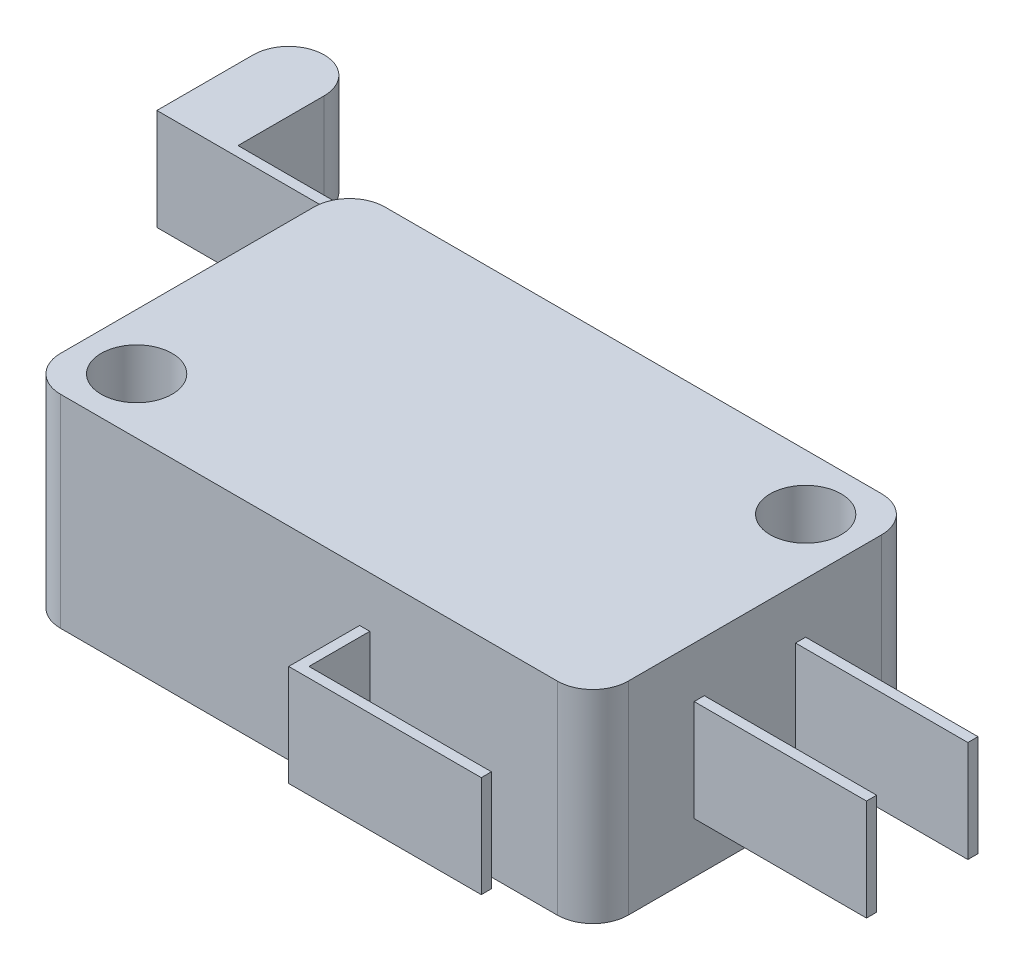
ISO-10303-21;
HEADER;
FILE_DESCRIPTION(('STEP AP214'),'2;1');
FILE_NAME('part.step','',(''),(''),'','','');
FILE_SCHEMA(('AUTOMOTIVE_DESIGN { 1 0 10303 214 1 1 1 1 }'));
ENDSEC;
DATA;
#1=APPLICATION_CONTEXT('core data for automotive mechanical design processes');
#2=APPLICATION_PROTOCOL_DEFINITION('international standard','automotive_design',2000,#1);
#3=PRODUCT_CONTEXT('',#1,'mechanical');
#4=PRODUCT('Part','Part','',(#3));
#5=PRODUCT_RELATED_PRODUCT_CATEGORY('part','',(#4));
#6=PRODUCT_DEFINITION_FORMATION('','',#4);
#7=PRODUCT_DEFINITION_CONTEXT('part definition',#1,'design');
#8=PRODUCT_DEFINITION('design','',#6,#7);
#9=PRODUCT_DEFINITION_SHAPE('','',#8);
#10=(LENGTH_UNIT() NAMED_UNIT(*) SI_UNIT(.MILLI.,.METRE.));
#11=(NAMED_UNIT(*) PLANE_ANGLE_UNIT() SI_UNIT($,.RADIAN.));
#12=(NAMED_UNIT(*) SI_UNIT($,.STERADIAN.) SOLID_ANGLE_UNIT());
#13=UNCERTAINTY_MEASURE_WITH_UNIT(LENGTH_MEASURE(1.E-05),#10,'distance_accuracy_value','');
#14=(GEOMETRIC_REPRESENTATION_CONTEXT(3) GLOBAL_UNCERTAINTY_ASSIGNED_CONTEXT((#13)) GLOBAL_UNIT_ASSIGNED_CONTEXT((#10,
#11,#12)) REPRESENTATION_CONTEXT('',''));
#15=CARTESIAN_POINT('',(0.,0.,0.));
#16=DIRECTION('',(0.,0.,1.));
#17=DIRECTION('',(1.,0.,0.));
#18=AXIS2_PLACEMENT_3D('',#15,#16,#17);
#19=CARTESIAN_POINT('',(28.,10.,0.));
#20=DIRECTION('',(-1.,0.,0.));
#21=DIRECTION('',(0.,0.,1.));
#22=AXIS2_PLACEMENT_3D('',#19,#20,#21);
#23=PLANE('',#22);
#24=DIRECTION('',(0.,0.,1.));
#25=VECTOR('',#24,1.);
#26=CARTESIAN_POINT('',(28.,2.5,0.));
#27=LINE('',#26,#25);
#28=CARTESIAN_POINT('',(28.,2.5,-5.5));
#29=VERTEX_POINT('',#28);
#30=CARTESIAN_POINT('',(28.,2.5,-5.));
#31=VERTEX_POINT('',#30);
#32=EDGE_CURVE('E284',#29,#31,#27,.T.);
#33=ORIENTED_EDGE('',*,*,#32,.T.);
#34=DIRECTION('',(0.,1.,0.));
#35=VECTOR('',#34,1.);
#36=CARTESIAN_POINT('',(28.,0.,-5.));
#37=LINE('',#36,#35);
#38=CARTESIAN_POINT('',(28.,7.5,-5.));
#39=VERTEX_POINT('',#38);
#40=EDGE_CURVE('E251',#31,#39,#37,.T.);
#41=ORIENTED_EDGE('',*,*,#40,.T.);
#42=DIRECTION('',(0.,0.,-1.));
#43=VECTOR('',#42,1.);
#44=CARTESIAN_POINT('',(28.,7.5,0.));
#45=LINE('',#44,#43);
#46=CARTESIAN_POINT('',(28.,7.5,-5.5));
#47=VERTEX_POINT('',#46);
#48=EDGE_CURVE('E269',#39,#47,#45,.T.);
#49=ORIENTED_EDGE('',*,*,#48,.T.);
#50=DIRECTION('',(0.,-1.,0.));
#51=VECTOR('',#50,1.);
#52=CARTESIAN_POINT('',(28.,0.,-5.5));
#53=LINE('',#52,#51);
#54=EDGE_CURVE('E288',#47,#29,#53,.T.);
#55=ORIENTED_EDGE('',*,*,#54,.T.);
#56=EDGE_LOOP('',(#33,#41,#49,#55));
#57=FACE_BOUND('',#56,.T.);
#58=DIRECTION('',(0.,0.,-1.));
#59=VECTOR('',#58,1.);
#60=CARTESIAN_POINT('',(28.,10.,0.));
#61=LINE('',#60,#59);
#62=CARTESIAN_POINT('',(28.,10.,-1.75));
#63=VERTEX_POINT('',#62);
#64=CARTESIAN_POINT('',(28.,10.,-14.25));
#65=VERTEX_POINT('',#64);
#66=EDGE_CURVE('E492',#63,#65,#61,.T.);
#67=ORIENTED_EDGE('',*,*,#66,.F.);
#68=DIRECTION('',(0.,-1.,0.));
#69=VECTOR('',#68,1.);
#70=CARTESIAN_POINT('',(28.,10.,-1.75));
#71=LINE('',#70,#69);
#72=CARTESIAN_POINT('',(28.,0.,-1.75));
#73=VERTEX_POINT('',#72);
#74=EDGE_CURVE('E536',#63,#73,#71,.T.);
#75=ORIENTED_EDGE('',*,*,#74,.T.);
#76=DIRECTION('',(0.,0.,-1.));
#77=VECTOR('',#76,1.);
#78=CARTESIAN_POINT('',(28.,0.,0.));
#79=LINE('',#78,#77);
#80=CARTESIAN_POINT('',(28.,0.,-14.25));
#81=VERTEX_POINT('',#80);
#82=EDGE_CURVE('E506',#73,#81,#79,.T.);
#83=ORIENTED_EDGE('',*,*,#82,.T.);
#84=DIRECTION('',(0.,-1.,0.));
#85=VECTOR('',#84,1.);
#86=CARTESIAN_POINT('',(28.,10.,-14.25));
#87=LINE('',#86,#85);
#88=EDGE_CURVE('E530',#81,#65,#87,.F.);
#89=ORIENTED_EDGE('',*,*,#88,.T.);
#90=EDGE_LOOP('',(#67,#75,#83,#89));
#91=FACE_BOUND('',#90,.T.);
#92=DIRECTION('',(0.,0.,-1.));
#93=VECTOR('',#92,1.);
#94=CARTESIAN_POINT('',(28.,2.5,0.));
#95=LINE('',#94,#93);
#96=CARTESIAN_POINT('',(28.,2.5,-9.99999999999999));
#97=VERTEX_POINT('',#96);
#98=CARTESIAN_POINT('',(28.,2.5,-10.5));
#99=VERTEX_POINT('',#98);
#100=EDGE_CURVE('E257',#97,#99,#95,.T.);
#101=ORIENTED_EDGE('',*,*,#100,.F.);
#102=DIRECTION('',(0.,-1.,0.));
#103=VECTOR('',#102,1.);
#104=CARTESIAN_POINT('',(28.,0.,-9.99999999999999));
#105=LINE('',#104,#103);
#106=CARTESIAN_POINT('',(28.,7.5,-10.));
#107=VERTEX_POINT('',#106);
#108=EDGE_CURVE('E308',#107,#97,#105,.T.);
#109=ORIENTED_EDGE('',*,*,#108,.F.);
#110=DIRECTION('',(0.,0.,1.));
#111=VECTOR('',#110,1.);
#112=CARTESIAN_POINT('',(28.,7.5,0.));
#113=LINE('',#112,#111);
#114=CARTESIAN_POINT('',(28.,7.5,-10.5));
#115=VERTEX_POINT('',#114);
#116=EDGE_CURVE('E325',#115,#107,#113,.T.);
#117=ORIENTED_EDGE('',*,*,#116,.F.);
#118=DIRECTION('',(0.,1.,0.));
#119=VECTOR('',#118,1.);
#120=CARTESIAN_POINT('',(28.,0.,-10.5));
#121=LINE('',#120,#119);
#122=EDGE_CURVE('E321',#99,#115,#121,.T.);
#123=ORIENTED_EDGE('',*,*,#122,.F.);
#124=EDGE_LOOP('',(#101,#109,#117,#123));
#125=FACE_BOUND('',#124,.T.);
#126=ADVANCED_FACE('F41',(#57,#91,#125),#23,.F.);
#127=CARTESIAN_POINT('',(17.,0.,3.5));
#128=DIRECTION('',(-1.,0.,0.));
#129=DIRECTION('',(0.,0.,1.));
#130=AXIS2_PLACEMENT_3D('',#127,#128,#129);
#131=PLANE('',#130);
#132=DIRECTION('',(0.,1.,0.));
#133=VECTOR('',#132,1.);
#134=CARTESIAN_POINT('',(17.,7.5,3.));
#135=LINE('',#134,#133);
#136=CARTESIAN_POINT('',(17.,2.5,3.));
#137=VERTEX_POINT('',#136);
#138=CARTESIAN_POINT('',(17.,7.5,3.));
#139=VERTEX_POINT('',#138);
#140=EDGE_CURVE('E347',#137,#139,#135,.T.);
#141=ORIENTED_EDGE('',*,*,#140,.F.);
#142=DIRECTION('',(0.,0.,-1.));
#143=VECTOR('',#142,1.);
#144=CARTESIAN_POINT('',(17.,2.5,3.5));
#145=LINE('',#144,#143);
#146=CARTESIAN_POINT('',(17.,2.5,0.));
#147=VERTEX_POINT('',#146);
#148=EDGE_CURVE('E407',#137,#147,#145,.T.);
#149=ORIENTED_EDGE('',*,*,#148,.T.);
#150=DIRECTION('',(0.,1.,0.));
#151=VECTOR('',#150,1.);
#152=CARTESIAN_POINT('',(17.,0.,0.));
#153=LINE('',#152,#151);
#154=CARTESIAN_POINT('',(17.,7.5,0.));
#155=VERTEX_POINT('',#154);
#156=EDGE_CURVE('E386',#147,#155,#153,.T.);
#157=ORIENTED_EDGE('',*,*,#156,.T.);
#158=DIRECTION('',(0.,0.,-1.));
#159=VECTOR('',#158,1.);
#160=CARTESIAN_POINT('',(17.,7.5,3.5));
#161=LINE('',#160,#159);
#162=EDGE_CURVE('E404',#139,#155,#161,.T.);
#163=ORIENTED_EDGE('',*,*,#162,.F.);
#164=EDGE_LOOP('',(#141,#149,#157,#163));
#165=FACE_BOUND('',#164,.T.);
#166=ADVANCED_FACE('F620',(#165),#131,.F.);
#167=CARTESIAN_POINT('',(0.,10.,0.));
#168=DIRECTION('',(0.,0.,-1.));
#169=DIRECTION('',(-1.,0.,0.));
#170=AXIS2_PLACEMENT_3D('',#167,#168,#169);
#171=PLANE('',#170);
#172=DIRECTION('',(1.,0.,0.));
#173=VECTOR('',#172,1.);
#174=CARTESIAN_POINT('',(0.,0.,0.));
#175=LINE('',#174,#173);
#176=CARTESIAN_POINT('',(1.75,0.,0.));
#177=VERTEX_POINT('',#176);
#178=CARTESIAN_POINT('',(26.25,0.,0.));
#179=VERTEX_POINT('',#178);
#180=EDGE_CURVE('E502',#177,#179,#175,.T.);
#181=ORIENTED_EDGE('',*,*,#180,.T.);
#182=DIRECTION('',(0.,-1.,0.));
#183=VECTOR('',#182,1.);
#184=CARTESIAN_POINT('',(26.25,10.,0.));
#185=LINE('',#184,#183);
#186=CARTESIAN_POINT('',(26.25,10.,0.));
#187=VERTEX_POINT('',#186);
#188=EDGE_CURVE('E556',#179,#187,#185,.F.);
#189=ORIENTED_EDGE('',*,*,#188,.T.);
#190=DIRECTION('',(1.,0.,0.));
#191=VECTOR('',#190,1.);
#192=CARTESIAN_POINT('',(0.,10.,0.));
#193=LINE('',#192,#191);
#194=CARTESIAN_POINT('',(1.75,10.,0.));
#195=VERTEX_POINT('',#194);
#196=EDGE_CURVE('E487',#195,#187,#193,.T.);
#197=ORIENTED_EDGE('',*,*,#196,.F.);
#198=DIRECTION('',(0.,-1.,0.));
#199=VECTOR('',#198,1.);
#200=CARTESIAN_POINT('',(1.75,10.,0.));
#201=LINE('',#200,#199);
#202=EDGE_CURVE('E552',#195,#177,#201,.T.);
#203=ORIENTED_EDGE('',*,*,#202,.T.);
#204=EDGE_LOOP('',(#181,#189,#197,#203));
#205=FACE_BOUND('',#204,.T.);
#206=DIRECTION('',(1.,0.,0.));
#207=VECTOR('',#206,1.);
#208=CARTESIAN_POINT('',(0.,2.5,0.));
#209=LINE('',#208,#207);
#210=CARTESIAN_POINT('',(16.5,2.5,0.));
#211=VERTEX_POINT('',#210);
#212=EDGE_CURVE('E371',#211,#147,#209,.T.);
#213=ORIENTED_EDGE('',*,*,#212,.F.);
#214=DIRECTION('',(0.,-1.,0.));
#215=VECTOR('',#214,1.);
#216=CARTESIAN_POINT('',(16.5,0.,0.));
#217=LINE('',#216,#215);
#218=CARTESIAN_POINT('',(16.5,7.5,0.));
#219=VERTEX_POINT('',#218);
#220=EDGE_CURVE('E376',#219,#211,#217,.T.);
#221=ORIENTED_EDGE('',*,*,#220,.F.);
#222=DIRECTION('',(-1.,0.,0.));
#223=VECTOR('',#222,1.);
#224=CARTESIAN_POINT('',(0.,7.5,0.));
#225=LINE('',#224,#223);
#226=EDGE_CURVE('E390',#155,#219,#225,.T.);
#227=ORIENTED_EDGE('',*,*,#226,.F.);
#228=ORIENTED_EDGE('',*,*,#156,.F.);
#229=EDGE_LOOP('',(#213,#221,#227,#228));
#230=FACE_BOUND('',#229,.T.);
#231=ADVANCED_FACE('F601',(#205,#230),#171,.F.);
#232=CARTESIAN_POINT('',(16.5,0.,-17.5));
#233=DIRECTION('',(-1.,0.,0.));
#234=DIRECTION('',(0.,0.,1.));
#235=AXIS2_PLACEMENT_3D('',#232,#233,#234);
#236=PLANE('',#235);
#237=DIRECTION('',(0.,0.,1.));
#238=VECTOR('',#237,1.);
#239=CARTESIAN_POINT('',(16.5,7.5,-17.5));
#240=LINE('',#239,#238);
#241=CARTESIAN_POINT('',(16.5,7.5,-17.));
#242=VERTEX_POINT('',#241);
#243=CARTESIAN_POINT('',(16.5,7.5,-16.));
#244=VERTEX_POINT('',#243);
#245=EDGE_CURVE('E473',#242,#244,#240,.T.);
#246=ORIENTED_EDGE('',*,*,#245,.F.);
#247=DIRECTION('',(0.,1.,0.));
#248=VECTOR('',#247,1.);
#249=CARTESIAN_POINT('',(16.5,7.5,-17.));
#250=LINE('',#249,#248);
#251=CARTESIAN_POINT('',(16.5,2.5,-17.));
#252=VERTEX_POINT('',#251);
#253=EDGE_CURVE('E421',#252,#242,#250,.T.);
#254=ORIENTED_EDGE('',*,*,#253,.F.);
#255=DIRECTION('',(0.,0.,1.));
#256=VECTOR('',#255,1.);
#257=CARTESIAN_POINT('',(16.5,2.5,-17.5));
#258=LINE('',#257,#256);
#259=CARTESIAN_POINT('',(16.5,2.5,-16.));
#260=VERTEX_POINT('',#259);
#261=EDGE_CURVE('E476',#252,#260,#258,.T.);
#262=ORIENTED_EDGE('',*,*,#261,.T.);
#263=DIRECTION('',(0.,-1.,0.));
#264=VECTOR('',#263,1.);
#265=CARTESIAN_POINT('',(16.5,0.,-16.));
#266=LINE('',#265,#264);
#267=EDGE_CURVE('E464',#244,#260,#266,.T.);
#268=ORIENTED_EDGE('',*,*,#267,.F.);
#269=EDGE_LOOP('',(#246,#254,#262,#268));
#270=FACE_BOUND('',#269,.T.);
#271=ADVANCED_FACE('F633',(#270),#236,.T.);
#272=CARTESIAN_POINT('',(0.,10.,-16.));
#273=DIRECTION('',(1.,0.,0.));
#274=DIRECTION('',(0.,0.,-1.));
#275=AXIS2_PLACEMENT_3D('',#272,#273,#274);
#276=PLANE('',#275);
#277=DIRECTION('',(0.,0.,1.));
#278=VECTOR('',#277,1.);
#279=CARTESIAN_POINT('',(0.,10.,-16.));
#280=LINE('',#279,#278);
#281=CARTESIAN_POINT('',(0.,10.,-14.25));
#282=VERTEX_POINT('',#281);
#283=CARTESIAN_POINT('',(0.,10.,-1.75));
#284=VERTEX_POINT('',#283);
#285=EDGE_CURVE('E483',#282,#284,#280,.T.);
#286=ORIENTED_EDGE('',*,*,#285,.F.);
#287=DIRECTION('',(0.,-1.,0.));
#288=VECTOR('',#287,1.);
#289=CARTESIAN_POINT('',(0.,10.,-14.25));
#290=LINE('',#289,#288);
#291=CARTESIAN_POINT('',(0.,0.,-14.25));
#292=VERTEX_POINT('',#291);
#293=EDGE_CURVE('E573',#282,#292,#290,.T.);
#294=ORIENTED_EDGE('',*,*,#293,.T.);
#295=DIRECTION('',(0.,0.,1.));
#296=VECTOR('',#295,1.);
#297=CARTESIAN_POINT('',(0.,0.,-16.));
#298=LINE('',#297,#296);
#299=CARTESIAN_POINT('',(0.,0.,-1.75));
#300=VERTEX_POINT('',#299);
#301=EDGE_CURVE('E482',#292,#300,#298,.T.);
#302=ORIENTED_EDGE('',*,*,#301,.T.);
#303=DIRECTION('',(0.,-1.,0.));
#304=VECTOR('',#303,1.);
#305=CARTESIAN_POINT('',(0.,10.,-1.75));
#306=LINE('',#305,#304);
#307=EDGE_CURVE('E570',#300,#284,#306,.F.);
#308=ORIENTED_EDGE('',*,*,#307,.T.);
#309=EDGE_LOOP('',(#286,#294,#302,#308));
#310=FACE_BOUND('',#309,.T.);
#311=ADVANCED_FACE('F592',(#310),#276,.F.);
#312=CARTESIAN_POINT('',(28.,10.,-16.));
#313=DIRECTION('',(0.,0.,1.));
#314=DIRECTION('',(1.,0.,0.));
#315=AXIS2_PLACEMENT_3D('',#312,#313,#314);
#316=PLANE('',#315);
#317=DIRECTION('',(1.,0.,0.));
#318=VECTOR('',#317,1.);
#319=CARTESIAN_POINT('',(0.,2.5,-16.));
#320=LINE('',#319,#318);
#321=CARTESIAN_POINT('',(17.,2.5,-16.));
#322=VERTEX_POINT('',#321);
#323=EDGE_CURVE('E460',#260,#322,#320,.T.);
#324=ORIENTED_EDGE('',*,*,#323,.T.);
#325=DIRECTION('',(0.,1.,0.));
#326=VECTOR('',#325,1.);
#327=CARTESIAN_POINT('',(17.,0.,-16.));
#328=LINE('',#327,#326);
#329=CARTESIAN_POINT('',(17.,7.5,-16.));
#330=VERTEX_POINT('',#329);
#331=EDGE_CURVE('E443',#322,#330,#328,.T.);
#332=ORIENTED_EDGE('',*,*,#331,.T.);
#333=DIRECTION('',(-1.,0.,0.));
#334=VECTOR('',#333,1.);
#335=CARTESIAN_POINT('',(0.,7.5,-16.));
#336=LINE('',#335,#334);
#337=EDGE_CURVE('E449',#330,#244,#336,.T.);
#338=ORIENTED_EDGE('',*,*,#337,.T.);
#339=ORIENTED_EDGE('',*,*,#267,.T.);
#340=EDGE_LOOP('',(#324,#332,#338,#339));
#341=FACE_BOUND('',#340,.T.);
#342=DIRECTION('',(-1.,0.,0.));
#343=VECTOR('',#342,1.);
#344=CARTESIAN_POINT('',(28.,0.,-16.));
#345=LINE('',#344,#343);
#346=CARTESIAN_POINT('',(26.25,0.,-16.));
#347=VERTEX_POINT('',#346);
#348=CARTESIAN_POINT('',(1.75000000000001,0.,-16.));
#349=VERTEX_POINT('',#348);
#350=EDGE_CURVE('E488',#347,#349,#345,.T.);
#351=ORIENTED_EDGE('',*,*,#350,.T.);
#352=DIRECTION('',(0.,-1.,0.));
#353=VECTOR('',#352,1.);
#354=CARTESIAN_POINT('',(1.75,10.,-16.));
#355=LINE('',#354,#353);
#356=CARTESIAN_POINT('',(1.75000000000001,10.,-16.));
#357=VERTEX_POINT('',#356);
#358=EDGE_CURVE('E11',#349,#357,#355,.F.);
#359=ORIENTED_EDGE('',*,*,#358,.T.);
#360=DIRECTION('',(-1.,0.,0.));
#361=VECTOR('',#360,1.);
#362=CARTESIAN_POINT('',(28.,10.,-16.));
#363=LINE('',#362,#361);
#364=CARTESIAN_POINT('',(26.25,10.,-16.));
#365=VERTEX_POINT('',#364);
#366=EDGE_CURVE('E495',#365,#357,#363,.T.);
#367=ORIENTED_EDGE('',*,*,#366,.F.);
#368=DIRECTION('',(0.,-1.,0.));
#369=VECTOR('',#368,1.);
#370=CARTESIAN_POINT('',(26.25,10.,-16.));
#371=LINE('',#370,#369);
#372=EDGE_CURVE('E50',#365,#347,#371,.T.);
#373=ORIENTED_EDGE('',*,*,#372,.T.);
#374=EDGE_LOOP('',(#351,#359,#367,#373));
#375=FACE_BOUND('',#374,.T.);
#376=ADVANCED_FACE('F580',(#341,#375),#316,.F.);
#377=CARTESIAN_POINT('',(0.,10.,0.));
#378=DIRECTION('',(0.,1.,0.));
#379=DIRECTION('',(0.,0.,1.));
#380=AXIS2_PLACEMENT_3D('',#377,#378,#379);
#381=PLANE('',#380);
#382=CARTESIAN_POINT('',(2.75,10.,-2.75));
#383=DIRECTION('',(0.,1.,0.));
#384=DIRECTION('',(0.,0.,1.));
#385=AXIS2_PLACEMENT_3D('',#382,#383,#384);
#386=CIRCLE('',#385,1.75);
#387=CARTESIAN_POINT('',(2.75,10.,-1.));
#388=VERTEX_POINT('',#387);
#389=EDGE_CURVE('E766',#388,#388,#386,.T.);
#390=ORIENTED_EDGE('',*,*,#389,.F.);
#391=EDGE_LOOP('',(#390));
#392=FACE_BOUND('',#391,.T.);
#393=CARTESIAN_POINT('',(25.25,10.,-13.25));
#394=DIRECTION('',(0.,1.,0.));
#395=DIRECTION('',(0.,0.,1.));
#396=AXIS2_PLACEMENT_3D('',#393,#394,#395);
#397=CIRCLE('',#396,1.75);
#398=CARTESIAN_POINT('',(25.25,10.,-11.5));
#399=VERTEX_POINT('',#398);
#400=EDGE_CURVE('E761',#399,#399,#397,.T.);
#401=ORIENTED_EDGE('',*,*,#400,.F.);
#402=EDGE_LOOP('',(#401));
#403=FACE_BOUND('',#402,.T.);
#404=ORIENTED_EDGE('',*,*,#196,.T.);
#405=CARTESIAN_POINT('',(26.25,10.,-1.75));
#406=DIRECTION('',(0.,1.,0.));
#407=DIRECTION('',(0.,0.,1.));
#408=AXIS2_PLACEMENT_3D('',#405,#406,#407);
#409=CIRCLE('',#408,1.75);
#410=EDGE_CURVE('E567',#187,#63,#409,.T.);
#411=ORIENTED_EDGE('',*,*,#410,.T.);
#412=ORIENTED_EDGE('',*,*,#66,.T.);
#413=CARTESIAN_POINT('',(26.25,10.,-14.25));
#414=DIRECTION('',(0.,1.,0.));
#415=DIRECTION('',(0.,0.,1.));
#416=AXIS2_PLACEMENT_3D('',#413,#414,#415);
#417=CIRCLE('',#416,1.75);
#418=EDGE_CURVE('E62',#65,#365,#417,.T.);
#419=ORIENTED_EDGE('',*,*,#418,.T.);
#420=ORIENTED_EDGE('',*,*,#366,.T.);
#421=CARTESIAN_POINT('',(1.75,10.,-14.25));
#422=DIRECTION('',(0.,1.,0.));
#423=DIRECTION('',(0.,0.,1.));
#424=AXIS2_PLACEMENT_3D('',#421,#422,#423);
#425=CIRCLE('',#424,1.75);
#426=EDGE_CURVE('E564',#357,#282,#425,.T.);
#427=ORIENTED_EDGE('',*,*,#426,.T.);
#428=ORIENTED_EDGE('',*,*,#285,.T.);
#429=CARTESIAN_POINT('',(1.75,10.,-1.75));
#430=DIRECTION('',(0.,1.,0.));
#431=DIRECTION('',(0.,0.,1.));
#432=AXIS2_PLACEMENT_3D('',#429,#430,#431);
#433=CIRCLE('',#432,1.75);
#434=EDGE_CURVE('E559',#284,#195,#433,.T.);
#435=ORIENTED_EDGE('',*,*,#434,.T.);
#436=EDGE_LOOP('',(#404,#411,#412,#419,#420,#427,#428,#435));
#437=FACE_BOUND('',#436,.T.);
#438=ADVANCED_FACE('F595',(#392,#403,#437),#381,.T.);
#439=CARTESIAN_POINT('',(0.,0.,0.));
#440=DIRECTION('',(0.,1.,0.));
#441=DIRECTION('',(0.,0.,1.));
#442=AXIS2_PLACEMENT_3D('',#439,#440,#441);
#443=PLANE('',#442);
#444=CARTESIAN_POINT('',(2.75,0.,-2.75));
#445=DIRECTION('',(0.,1.,0.));
#446=DIRECTION('',(0.,0.,1.));
#447=AXIS2_PLACEMENT_3D('',#444,#445,#446);
#448=CIRCLE('',#447,1.75);
#449=CARTESIAN_POINT('',(2.75,0.,-1.));
#450=VERTEX_POINT('',#449);
#451=EDGE_CURVE('E757',#450,#450,#448,.T.);
#452=ORIENTED_EDGE('',*,*,#451,.T.);
#453=EDGE_LOOP('',(#452));
#454=FACE_BOUND('',#453,.T.);
#455=CARTESIAN_POINT('',(25.25,0.,-13.25));
#456=DIRECTION('',(0.,1.,0.));
#457=DIRECTION('',(0.,0.,1.));
#458=AXIS2_PLACEMENT_3D('',#455,#456,#457);
#459=CIRCLE('',#458,1.75);
#460=CARTESIAN_POINT('',(25.25,0.,-11.5));
#461=VERTEX_POINT('',#460);
#462=EDGE_CURVE('E285',#461,#461,#459,.T.);
#463=ORIENTED_EDGE('',*,*,#462,.T.);
#464=EDGE_LOOP('',(#463));
#465=FACE_BOUND('',#464,.T.);
#466=ORIENTED_EDGE('',*,*,#82,.F.);
#467=CARTESIAN_POINT('',(26.25,0.,-1.75));
#468=DIRECTION('',(0.,1.,0.));
#469=DIRECTION('',(0.,0.,1.));
#470=AXIS2_PLACEMENT_3D('',#467,#468,#469);
#471=CIRCLE('',#470,1.75);
#472=EDGE_CURVE('E549',#73,#179,#471,.F.);
#473=ORIENTED_EDGE('',*,*,#472,.T.);
#474=ORIENTED_EDGE('',*,*,#180,.F.);
#475=CARTESIAN_POINT('',(1.75,0.,-1.75));
#476=DIRECTION('',(0.,1.,0.));
#477=DIRECTION('',(0.,0.,1.));
#478=AXIS2_PLACEMENT_3D('',#475,#476,#477);
#479=CIRCLE('',#478,1.75);
#480=EDGE_CURVE('E540',#177,#300,#479,.F.);
#481=ORIENTED_EDGE('',*,*,#480,.T.);
#482=ORIENTED_EDGE('',*,*,#301,.F.);
#483=CARTESIAN_POINT('',(1.75,0.,-14.25));
#484=DIRECTION('',(0.,1.,0.));
#485=DIRECTION('',(0.,0.,1.));
#486=AXIS2_PLACEMENT_3D('',#483,#484,#485);
#487=CIRCLE('',#486,1.75);
#488=EDGE_CURVE('E546',#292,#349,#487,.F.);
#489=ORIENTED_EDGE('',*,*,#488,.T.);
#490=ORIENTED_EDGE('',*,*,#350,.F.);
#491=CARTESIAN_POINT('',(26.25,0.,-14.25));
#492=DIRECTION('',(0.,1.,0.));
#493=DIRECTION('',(0.,0.,1.));
#494=AXIS2_PLACEMENT_3D('',#491,#492,#493);
#495=CIRCLE('',#494,1.75);
#496=EDGE_CURVE('E543',#347,#81,#495,.F.);
#497=ORIENTED_EDGE('',*,*,#496,.T.);
#498=EDGE_LOOP('',(#466,#473,#474,#481,#482,#489,#490,#497));
#499=FACE_BOUND('',#498,.T.);
#500=ADVANCED_FACE('F584',(#454,#465,#499),#443,.F.);
#501=CARTESIAN_POINT('',(17.,0.,-17.5));
#502=DIRECTION('',(1.,0.,0.));
#503=DIRECTION('',(0.,0.,-1.));
#504=AXIS2_PLACEMENT_3D('',#501,#502,#503);
#505=PLANE('',#504);
#506=ORIENTED_EDGE('',*,*,#331,.F.);
#507=DIRECTION('',(0.,0.,1.));
#508=VECTOR('',#507,1.);
#509=CARTESIAN_POINT('',(17.,2.5,-17.5));
#510=LINE('',#509,#508);
#511=CARTESIAN_POINT('',(17.,2.5,-17.5));
#512=VERTEX_POINT('',#511);
#513=EDGE_CURVE('E479',#512,#322,#510,.T.);
#514=ORIENTED_EDGE('',*,*,#513,.F.);
#515=DIRECTION('',(0.,1.,0.));
#516=VECTOR('',#515,1.);
#517=CARTESIAN_POINT('',(17.,0.,-17.5));
#518=LINE('',#517,#516);
#519=CARTESIAN_POINT('',(17.,7.5,-17.5));
#520=VERTEX_POINT('',#519);
#521=EDGE_CURVE('E444',#512,#520,#518,.T.);
#522=ORIENTED_EDGE('',*,*,#521,.T.);
#523=DIRECTION('',(0.,0.,1.));
#524=VECTOR('',#523,1.);
#525=CARTESIAN_POINT('',(17.,7.5,-17.5));
#526=LINE('',#525,#524);
#527=EDGE_CURVE('E456',#520,#330,#526,.T.);
#528=ORIENTED_EDGE('',*,*,#527,.T.);
#529=EDGE_LOOP('',(#506,#514,#522,#528));
#530=FACE_BOUND('',#529,.T.);
#531=ADVANCED_FACE('F744',(#530),#505,.T.);
#532=CARTESIAN_POINT('',(0.,2.5,-17.5));
#533=DIRECTION('',(0.,-1.,0.));
#534=DIRECTION('',(0.,0.,-1.));
#535=AXIS2_PLACEMENT_3D('',#532,#533,#534);
#536=PLANE('',#535);
#537=CARTESIAN_POINT('',(-8.75,2.5,-21.75));
#538=DIRECTION('',(0.,-1.,0.));
#539=DIRECTION('',(0.,0.,-1.));
#540=AXIS2_PLACEMENT_3D('',#537,#538,#539);
#541=CIRCLE('',#540,1.75);
#542=CARTESIAN_POINT('',(-10.5,2.5,-21.75));
#543=VERTEX_POINT('',#542);
#544=CARTESIAN_POINT('',(-8.75,2.5,-23.5));
#545=VERTEX_POINT('',#544);
#546=EDGE_CURVE('E498',#543,#545,#541,.T.);
#547=ORIENTED_EDGE('',*,*,#546,.T.);
#548=CARTESIAN_POINT('',(-8.75,2.5,-21.75));
#549=DIRECTION('',(0.,-1.,0.));
#550=DIRECTION('',(0.,0.,-1.));
#551=AXIS2_PLACEMENT_3D('',#548,#549,#550);
#552=CIRCLE('',#551,1.75);
#553=CARTESIAN_POINT('',(-7.,2.5,-21.75));
#554=VERTEX_POINT('',#553);
#555=EDGE_CURVE('E514',#545,#554,#552,.T.);
#556=ORIENTED_EDGE('',*,*,#555,.T.);
#557=DIRECTION('',(0.,0.,1.));
#558=VECTOR('',#557,1.);
#559=CARTESIAN_POINT('',(-7.,2.5,-17.5));
#560=LINE('',#559,#558);
#561=CARTESIAN_POINT('',(-7.,2.5,-17.5));
#562=VERTEX_POINT('',#561);
#563=EDGE_CURVE('E411',#554,#562,#560,.T.);
#564=ORIENTED_EDGE('',*,*,#563,.T.);
#565=DIRECTION('',(1.,0.,0.));
#566=VECTOR('',#565,1.);
#567=CARTESIAN_POINT('',(0.,2.5,-17.5));
#568=LINE('',#567,#566);
#569=EDGE_CURVE('E448',#562,#512,#568,.T.);
#570=ORIENTED_EDGE('',*,*,#569,.T.);
#571=ORIENTED_EDGE('',*,*,#513,.T.);
#572=ORIENTED_EDGE('',*,*,#323,.F.);
#573=ORIENTED_EDGE('',*,*,#261,.F.);
#574=DIRECTION('',(1.,0.,0.));
#575=VECTOR('',#574,1.);
#576=CARTESIAN_POINT('',(-10.5,2.5,-17.));
#577=LINE('',#576,#575);
#578=CARTESIAN_POINT('',(-10.5,2.5,-17.));
#579=VERTEX_POINT('',#578);
#580=EDGE_CURVE('E439',#579,#252,#577,.T.);
#581=ORIENTED_EDGE('',*,*,#580,.F.);
#582=DIRECTION('',(0.,0.,1.));
#583=VECTOR('',#582,1.);
#584=CARTESIAN_POINT('',(-10.5,2.5,-17.5));
#585=LINE('',#584,#583);
#586=EDGE_CURVE('E422',#543,#579,#585,.T.);
#587=ORIENTED_EDGE('',*,*,#586,.F.);
#588=EDGE_LOOP('',(#547,#556,#564,#570,#571,#572,#573,#581,#587));
#589=FACE_BOUND('',#588,.T.);
#590=ADVANCED_FACE('F737',(#589),#536,.T.);
#591=CARTESIAN_POINT('',(0.,7.5,-17.5));
#592=DIRECTION('',(0.,1.,0.));
#593=DIRECTION('',(0.,0.,1.));
#594=AXIS2_PLACEMENT_3D('',#591,#592,#593);
#595=PLANE('',#594);
#596=DIRECTION('',(0.,0.,1.));
#597=VECTOR('',#596,1.);
#598=CARTESIAN_POINT('',(-7.,7.5,-17.5));
#599=LINE('',#598,#597);
#600=CARTESIAN_POINT('',(-7.,7.5,-21.75));
#601=VERTEX_POINT('',#600);
#602=CARTESIAN_POINT('',(-7.,7.5,-17.5));
#603=VERTEX_POINT('',#602);
#604=EDGE_CURVE('E414',#601,#603,#599,.T.);
#605=ORIENTED_EDGE('',*,*,#604,.F.);
#606=CARTESIAN_POINT('',(-8.75,7.5,-21.75));
#607=DIRECTION('',(0.,1.,0.));
#608=DIRECTION('',(0.,0.,1.));
#609=AXIS2_PLACEMENT_3D('',#606,#607,#608);
#610=CIRCLE('',#609,1.75);
#611=CARTESIAN_POINT('',(-8.75,7.5,-23.5));
#612=VERTEX_POINT('',#611);
#613=EDGE_CURVE('E524',#601,#612,#610,.T.);
#614=ORIENTED_EDGE('',*,*,#613,.T.);
#615=CARTESIAN_POINT('',(-8.75,7.5,-21.75));
#616=DIRECTION('',(0.,1.,0.));
#617=DIRECTION('',(0.,0.,1.));
#618=AXIS2_PLACEMENT_3D('',#615,#616,#617);
#619=CIRCLE('',#618,1.75);
#620=CARTESIAN_POINT('',(-10.5,7.5,-21.75));
#621=VERTEX_POINT('',#620);
#622=EDGE_CURVE('E521',#612,#621,#619,.T.);
#623=ORIENTED_EDGE('',*,*,#622,.T.);
#624=DIRECTION('',(0.,0.,-1.));
#625=VECTOR('',#624,1.);
#626=CARTESIAN_POINT('',(-10.5,7.5,-17.5));
#627=LINE('',#626,#625);
#628=CARTESIAN_POINT('',(-10.5,7.5,-17.));
#629=VERTEX_POINT('',#628);
#630=EDGE_CURVE('E428',#629,#621,#627,.T.);
#631=ORIENTED_EDGE('',*,*,#630,.F.);
#632=DIRECTION('',(1.,0.,0.));
#633=VECTOR('',#632,1.);
#634=CARTESIAN_POINT('',(-10.5,7.5,-17.));
#635=LINE('',#634,#633);
#636=EDGE_CURVE('E432',#629,#242,#635,.T.);
#637=ORIENTED_EDGE('',*,*,#636,.T.);
#638=ORIENTED_EDGE('',*,*,#245,.T.);
#639=ORIENTED_EDGE('',*,*,#337,.F.);
#640=ORIENTED_EDGE('',*,*,#527,.F.);
#641=DIRECTION('',(-1.,0.,0.));
#642=VECTOR('',#641,1.);
#643=CARTESIAN_POINT('',(0.,7.5,-17.5));
#644=LINE('',#643,#642);
#645=EDGE_CURVE('E452',#520,#603,#644,.T.);
#646=ORIENTED_EDGE('',*,*,#645,.T.);
#647=EDGE_LOOP('',(#605,#614,#623,#631,#637,#638,#639,#640,#646));
#648=FACE_BOUND('',#647,.T.);
#649=ADVANCED_FACE('F733',(#648),#595,.T.);
#650=CARTESIAN_POINT('',(0.,0.,-17.5));
#651=DIRECTION('',(0.,0.,-1.));
#652=DIRECTION('',(-1.,0.,0.));
#653=AXIS2_PLACEMENT_3D('',#650,#651,#652);
#654=PLANE('',#653);
#655=DIRECTION('',(0.,-1.,0.));
#656=VECTOR('',#655,1.);
#657=CARTESIAN_POINT('',(-7.,14.4462219947249,-17.5));
#658=LINE('',#657,#656);
#659=EDGE_CURVE('E417',#603,#562,#658,.T.);
#660=ORIENTED_EDGE('',*,*,#659,.F.);
#661=ORIENTED_EDGE('',*,*,#645,.F.);
#662=ORIENTED_EDGE('',*,*,#521,.F.);
#663=ORIENTED_EDGE('',*,*,#569,.F.);
#664=EDGE_LOOP('',(#660,#661,#662,#663));
#665=FACE_BOUND('',#664,.T.);
#666=ADVANCED_FACE('F729',(#665),#654,.T.);
#667=CARTESIAN_POINT('',(-10.5,7.5,-17.));
#668=DIRECTION('',(0.,0.,-1.));
#669=DIRECTION('',(-1.,0.,0.));
#670=AXIS2_PLACEMENT_3D('',#667,#668,#669);
#671=PLANE('',#670);
#672=ORIENTED_EDGE('',*,*,#253,.T.);
#673=ORIENTED_EDGE('',*,*,#636,.F.);
#674=DIRECTION('',(0.,1.,0.));
#675=VECTOR('',#674,1.);
#676=CARTESIAN_POINT('',(-10.5,7.5,-17.));
#677=LINE('',#676,#675);
#678=EDGE_CURVE('E425',#579,#629,#677,.T.);
#679=ORIENTED_EDGE('',*,*,#678,.F.);
#680=ORIENTED_EDGE('',*,*,#580,.T.);
#681=EDGE_LOOP('',(#672,#673,#679,#680));
#682=FACE_BOUND('',#681,.T.);
#683=ADVANCED_FACE('F725',(#682),#671,.F.);
#684=CARTESIAN_POINT('',(-10.5,0.,0.));
#685=DIRECTION('',(-1.,0.,0.));
#686=DIRECTION('',(0.,0.,1.));
#687=AXIS2_PLACEMENT_3D('',#684,#685,#686);
#688=PLANE('',#687);
#689=ORIENTED_EDGE('',*,*,#630,.T.);
#690=DIRECTION('',(0.,-1.,0.));
#691=VECTOR('',#690,1.);
#692=CARTESIAN_POINT('',(-10.5,0.,-21.75));
#693=LINE('',#692,#691);
#694=EDGE_CURVE('E527',#621,#543,#693,.T.);
#695=ORIENTED_EDGE('',*,*,#694,.T.);
#696=ORIENTED_EDGE('',*,*,#586,.T.);
#697=ORIENTED_EDGE('',*,*,#678,.T.);
#698=EDGE_LOOP('',(#689,#695,#696,#697));
#699=FACE_BOUND('',#698,.T.);
#700=ADVANCED_FACE('F721',(#699),#688,.T.);
#701=CARTESIAN_POINT('',(-7.,14.4462219947249,-17.5));
#702=DIRECTION('',(1.,0.,0.));
#703=DIRECTION('',(0.,0.,-1.));
#704=AXIS2_PLACEMENT_3D('',#701,#702,#703);
#705=PLANE('',#704);
#706=ORIENTED_EDGE('',*,*,#563,.F.);
#707=DIRECTION('',(0.,-1.,0.));
#708=VECTOR('',#707,1.);
#709=CARTESIAN_POINT('',(-7.,14.4462219947249,-21.75));
#710=LINE('',#709,#708);
#711=EDGE_CURVE('E517',#554,#601,#710,.F.);
#712=ORIENTED_EDGE('',*,*,#711,.T.);
#713=ORIENTED_EDGE('',*,*,#604,.T.);
#714=ORIENTED_EDGE('',*,*,#659,.T.);
#715=EDGE_LOOP('',(#706,#712,#713,#714));
#716=FACE_BOUND('',#715,.T.);
#717=ADVANCED_FACE('F644',(#716),#705,.T.);
#718=CARTESIAN_POINT('',(-8.75,0.,-21.75));
#719=DIRECTION('',(0.,-1.,0.));
#720=DIRECTION('',(0.,0.,-1.));
#721=AXIS2_PLACEMENT_3D('',#718,#719,#720);
#722=CYLINDRICAL_SURFACE('',#721,1.75);
#723=ORIENTED_EDGE('',*,*,#694,.F.);
#724=ORIENTED_EDGE('',*,*,#622,.F.);
#725=DIRECTION('',(0.,-1.,0.));
#726=VECTOR('',#725,1.);
#727=CARTESIAN_POINT('',(-8.75,14.4462219947249,-23.5));
#728=LINE('',#727,#726);
#729=EDGE_CURVE('E410',#545,#612,#728,.F.);
#730=ORIENTED_EDGE('',*,*,#729,.F.);
#731=ORIENTED_EDGE('',*,*,#546,.F.);
#732=EDGE_LOOP('',(#723,#724,#730,#731));
#733=FACE_BOUND('',#732,.T.);
#734=ADVANCED_FACE('F640',(#733),#722,.T.);
#735=CARTESIAN_POINT('',(-8.75,14.4462219947249,-21.75));
#736=DIRECTION('',(0.,-1.,0.));
#737=DIRECTION('',(0.,0.,-1.));
#738=AXIS2_PLACEMENT_3D('',#735,#736,#737);
#739=CYLINDRICAL_SURFACE('',#738,1.75);
#740=ORIENTED_EDGE('',*,*,#613,.F.);
#741=ORIENTED_EDGE('',*,*,#711,.F.);
#742=ORIENTED_EDGE('',*,*,#555,.F.);
#743=ORIENTED_EDGE('',*,*,#729,.T.);
#744=EDGE_LOOP('',(#740,#741,#742,#743));
#745=FACE_BOUND('',#744,.T.);
#746=ADVANCED_FACE('F636',(#745),#739,.T.);
#747=CARTESIAN_POINT('',(0.,2.5,3.5));
#748=DIRECTION('',(0.,1.,0.));
#749=DIRECTION('',(0.,0.,1.));
#750=AXIS2_PLACEMENT_3D('',#747,#748,#749);
#751=PLANE('',#750);
#752=ORIENTED_EDGE('',*,*,#212,.T.);
#753=ORIENTED_EDGE('',*,*,#148,.F.);
#754=DIRECTION('',(-1.,0.,0.));
#755=VECTOR('',#754,1.);
#756=CARTESIAN_POINT('',(26.,2.5,3.));
#757=LINE('',#756,#755);
#758=CARTESIAN_POINT('',(26.,2.5,3.));
#759=VERTEX_POINT('',#758);
#760=EDGE_CURVE('E368',#759,#137,#757,.T.);
#761=ORIENTED_EDGE('',*,*,#760,.F.);
#762=DIRECTION('',(0.,0.,-1.));
#763=VECTOR('',#762,1.);
#764=CARTESIAN_POINT('',(26.,2.5,3.5));
#765=LINE('',#764,#763);
#766=CARTESIAN_POINT('',(26.,2.5,3.5));
#767=VERTEX_POINT('',#766);
#768=EDGE_CURVE('E352',#767,#759,#765,.T.);
#769=ORIENTED_EDGE('',*,*,#768,.F.);
#770=DIRECTION('',(1.,0.,0.));
#771=VECTOR('',#770,1.);
#772=CARTESIAN_POINT('',(0.,2.5,3.5));
#773=LINE('',#772,#771);
#774=CARTESIAN_POINT('',(16.5,2.5,3.5));
#775=VERTEX_POINT('',#774);
#776=EDGE_CURVE('E372',#775,#767,#773,.T.);
#777=ORIENTED_EDGE('',*,*,#776,.F.);
#778=DIRECTION('',(0.,0.,-1.));
#779=VECTOR('',#778,1.);
#780=CARTESIAN_POINT('',(16.5,2.5,3.5));
#781=LINE('',#780,#779);
#782=EDGE_CURVE('E382',#775,#211,#781,.T.);
#783=ORIENTED_EDGE('',*,*,#782,.T.);
#784=EDGE_LOOP('',(#752,#753,#761,#769,#777,#783));
#785=FACE_BOUND('',#784,.T.);
#786=ADVANCED_FACE('F639',(#785),#751,.F.);
#787=CARTESIAN_POINT('',(0.,7.5,3.5));
#788=DIRECTION('',(0.,-1.,0.));
#789=DIRECTION('',(0.,0.,-1.));
#790=AXIS2_PLACEMENT_3D('',#787,#788,#789);
#791=PLANE('',#790);
#792=ORIENTED_EDGE('',*,*,#226,.T.);
#793=DIRECTION('',(0.,0.,-1.));
#794=VECTOR('',#793,1.);
#795=CARTESIAN_POINT('',(16.5,7.5,3.5));
#796=LINE('',#795,#794);
#797=CARTESIAN_POINT('',(16.5,7.5,3.5));
#798=VERTEX_POINT('',#797);
#799=EDGE_CURVE('E400',#798,#219,#796,.T.);
#800=ORIENTED_EDGE('',*,*,#799,.F.);
#801=DIRECTION('',(-1.,0.,0.));
#802=VECTOR('',#801,1.);
#803=CARTESIAN_POINT('',(0.,7.5,3.5));
#804=LINE('',#803,#802);
#805=CARTESIAN_POINT('',(26.,7.5,3.5));
#806=VERTEX_POINT('',#805);
#807=EDGE_CURVE('E375',#806,#798,#804,.T.);
#808=ORIENTED_EDGE('',*,*,#807,.F.);
#809=DIRECTION('',(0.,0.,1.));
#810=VECTOR('',#809,1.);
#811=CARTESIAN_POINT('',(26.,7.5,3.5));
#812=LINE('',#811,#810);
#813=CARTESIAN_POINT('',(26.,7.5,3.));
#814=VERTEX_POINT('',#813);
#815=EDGE_CURVE('E358',#814,#806,#812,.T.);
#816=ORIENTED_EDGE('',*,*,#815,.F.);
#817=DIRECTION('',(-1.,0.,0.));
#818=VECTOR('',#817,1.);
#819=CARTESIAN_POINT('',(26.,7.5,3.));
#820=LINE('',#819,#818);
#821=EDGE_CURVE('E362',#814,#139,#820,.T.);
#822=ORIENTED_EDGE('',*,*,#821,.T.);
#823=ORIENTED_EDGE('',*,*,#162,.T.);
#824=EDGE_LOOP('',(#792,#800,#808,#816,#822,#823));
#825=FACE_BOUND('',#824,.T.);
#826=ADVANCED_FACE('F711',(#825),#791,.F.);
#827=CARTESIAN_POINT('',(16.5,0.,3.5));
#828=DIRECTION('',(1.,0.,0.));
#829=DIRECTION('',(0.,0.,-1.));
#830=AXIS2_PLACEMENT_3D('',#827,#828,#829);
#831=PLANE('',#830);
#832=ORIENTED_EDGE('',*,*,#220,.T.);
#833=ORIENTED_EDGE('',*,*,#782,.F.);
#834=DIRECTION('',(0.,-1.,0.));
#835=VECTOR('',#834,1.);
#836=CARTESIAN_POINT('',(16.5,0.,3.5));
#837=LINE('',#836,#835);
#838=EDGE_CURVE('E379',#798,#775,#837,.T.);
#839=ORIENTED_EDGE('',*,*,#838,.F.);
#840=ORIENTED_EDGE('',*,*,#799,.T.);
#841=EDGE_LOOP('',(#832,#833,#839,#840));
#842=FACE_BOUND('',#841,.T.);
#843=ADVANCED_FACE('F707',(#842),#831,.F.);
#844=CARTESIAN_POINT('',(0.,0.,3.5));
#845=DIRECTION('',(0.,0.,1.));
#846=DIRECTION('',(1.,0.,0.));
#847=AXIS2_PLACEMENT_3D('',#844,#845,#846);
#848=PLANE('',#847);
#849=ORIENTED_EDGE('',*,*,#776,.T.);
#850=DIRECTION('',(0.,-1.,0.));
#851=VECTOR('',#850,1.);
#852=CARTESIAN_POINT('',(26.,7.5,3.5));
#853=LINE('',#852,#851);
#854=EDGE_CURVE('E348',#806,#767,#853,.T.);
#855=ORIENTED_EDGE('',*,*,#854,.F.);
#856=ORIENTED_EDGE('',*,*,#807,.T.);
#857=ORIENTED_EDGE('',*,*,#838,.T.);
#858=EDGE_LOOP('',(#849,#855,#856,#857));
#859=FACE_BOUND('',#858,.T.);
#860=ADVANCED_FACE('F703',(#859),#848,.T.);
#861=CARTESIAN_POINT('',(26.,7.5,3.));
#862=DIRECTION('',(0.,0.,1.));
#863=DIRECTION('',(0.,-1.,0.));
#864=AXIS2_PLACEMENT_3D('',#861,#862,#863);
#865=PLANE('',#864);
#866=ORIENTED_EDGE('',*,*,#140,.T.);
#867=ORIENTED_EDGE('',*,*,#821,.F.);
#868=DIRECTION('',(0.,1.,0.));
#869=VECTOR('',#868,1.);
#870=CARTESIAN_POINT('',(26.,7.5,3.));
#871=LINE('',#870,#869);
#872=EDGE_CURVE('E355',#759,#814,#871,.T.);
#873=ORIENTED_EDGE('',*,*,#872,.F.);
#874=ORIENTED_EDGE('',*,*,#760,.T.);
#875=EDGE_LOOP('',(#866,#867,#873,#874));
#876=FACE_BOUND('',#875,.T.);
#877=ADVANCED_FACE('F699',(#876),#865,.F.);
#878=CARTESIAN_POINT('',(26.,0.,0.));
#879=DIRECTION('',(1.,0.,0.));
#880=DIRECTION('',(0.,0.,-1.));
#881=AXIS2_PLACEMENT_3D('',#878,#879,#880);
#882=PLANE('',#881);
#883=ORIENTED_EDGE('',*,*,#854,.T.);
#884=ORIENTED_EDGE('',*,*,#768,.T.);
#885=ORIENTED_EDGE('',*,*,#872,.T.);
#886=ORIENTED_EDGE('',*,*,#815,.T.);
#887=EDGE_LOOP('',(#883,#884,#885,#886));
#888=FACE_BOUND('',#887,.T.);
#889=ADVANCED_FACE('F695',(#888),#882,.T.);
#890=CARTESIAN_POINT('',(36.5,2.5,0.));
#891=DIRECTION('',(0.,1.,0.));
#892=DIRECTION('',(0.,0.,1.));
#893=AXIS2_PLACEMENT_3D('',#890,#891,#892);
#894=PLANE('',#893);
#895=ORIENTED_EDGE('',*,*,#100,.T.);
#896=DIRECTION('',(-1.,0.,0.));
#897=VECTOR('',#896,1.);
#898=CARTESIAN_POINT('',(36.5,2.5,-10.5));
#899=LINE('',#898,#897);
#900=CARTESIAN_POINT('',(36.5,2.5,-10.5));
#901=VERTEX_POINT('',#900);
#902=EDGE_CURVE('E343',#901,#99,#899,.T.);
#903=ORIENTED_EDGE('',*,*,#902,.F.);
#904=DIRECTION('',(0.,0.,-1.));
#905=VECTOR('',#904,1.);
#906=CARTESIAN_POINT('',(36.5,2.5,0.));
#907=LINE('',#906,#905);
#908=CARTESIAN_POINT('',(36.5,2.5,-9.99999999999999));
#909=VERTEX_POINT('',#908);
#910=EDGE_CURVE('E303',#909,#901,#907,.T.);
#911=ORIENTED_EDGE('',*,*,#910,.F.);
#912=DIRECTION('',(-1.,0.,0.));
#913=VECTOR('',#912,1.);
#914=CARTESIAN_POINT('',(36.5,2.5,-9.99999999999999));
#915=LINE('',#914,#913);
#916=EDGE_CURVE('E317',#909,#97,#915,.T.);
#917=ORIENTED_EDGE('',*,*,#916,.T.);
#918=EDGE_LOOP('',(#895,#903,#911,#917));
#919=FACE_BOUND('',#918,.T.);
#920=ADVANCED_FACE('F691',(#919),#894,.F.);
#921=CARTESIAN_POINT('',(36.5,0.,-10.5));
#922=DIRECTION('',(0.,0.,1.));
#923=DIRECTION('',(1.,0.,0.));
#924=AXIS2_PLACEMENT_3D('',#921,#922,#923);
#925=PLANE('',#924);
#926=ORIENTED_EDGE('',*,*,#122,.T.);
#927=DIRECTION('',(-1.,0.,0.));
#928=VECTOR('',#927,1.);
#929=CARTESIAN_POINT('',(36.5,7.5,-10.5));
#930=LINE('',#929,#928);
#931=CARTESIAN_POINT('',(36.5,7.5,-10.5));
#932=VERTEX_POINT('',#931);
#933=EDGE_CURVE('E339',#932,#115,#930,.T.);
#934=ORIENTED_EDGE('',*,*,#933,.F.);
#935=DIRECTION('',(0.,1.,0.));
#936=VECTOR('',#935,1.);
#937=CARTESIAN_POINT('',(36.5,0.,-10.5));
#938=LINE('',#937,#936);
#939=EDGE_CURVE('E307',#901,#932,#938,.T.);
#940=ORIENTED_EDGE('',*,*,#939,.F.);
#941=ORIENTED_EDGE('',*,*,#902,.T.);
#942=EDGE_LOOP('',(#926,#934,#940,#941));
#943=FACE_BOUND('',#942,.T.);
#944=ADVANCED_FACE('F687',(#943),#925,.F.);
#945=CARTESIAN_POINT('',(36.5,7.5,0.));
#946=DIRECTION('',(0.,-1.,0.));
#947=DIRECTION('',(0.,0.,-1.));
#948=AXIS2_PLACEMENT_3D('',#945,#946,#947);
#949=PLANE('',#948);
#950=ORIENTED_EDGE('',*,*,#116,.T.);
#951=DIRECTION('',(-1.,0.,0.));
#952=VECTOR('',#951,1.);
#953=CARTESIAN_POINT('',(36.5,7.5,-10.));
#954=LINE('',#953,#952);
#955=CARTESIAN_POINT('',(36.5,7.5,-10.));
#956=VERTEX_POINT('',#955);
#957=EDGE_CURVE('E335',#956,#107,#954,.T.);
#958=ORIENTED_EDGE('',*,*,#957,.F.);
#959=DIRECTION('',(0.,0.,1.));
#960=VECTOR('',#959,1.);
#961=CARTESIAN_POINT('',(36.5,7.5,0.));
#962=LINE('',#961,#960);
#963=EDGE_CURVE('E311',#932,#956,#962,.T.);
#964=ORIENTED_EDGE('',*,*,#963,.F.);
#965=ORIENTED_EDGE('',*,*,#933,.T.);
#966=EDGE_LOOP('',(#950,#958,#964,#965));
#967=FACE_BOUND('',#966,.T.);
#968=ADVANCED_FACE('F683',(#967),#949,.F.);
#969=CARTESIAN_POINT('',(36.5,0.,-9.99999999999999));
#970=DIRECTION('',(0.,0.,-1.));
#971=DIRECTION('',(0.,1.,0.));
#972=AXIS2_PLACEMENT_3D('',#969,#970,#971);
#973=PLANE('',#972);
#974=ORIENTED_EDGE('',*,*,#108,.T.);
#975=ORIENTED_EDGE('',*,*,#916,.F.);
#976=DIRECTION('',(0.,-1.,0.));
#977=VECTOR('',#976,1.);
#978=CARTESIAN_POINT('',(36.5,0.,-9.99999999999999));
#979=LINE('',#978,#977);
#980=EDGE_CURVE('E314',#956,#909,#979,.T.);
#981=ORIENTED_EDGE('',*,*,#980,.F.);
#982=ORIENTED_EDGE('',*,*,#957,.T.);
#983=EDGE_LOOP('',(#974,#975,#981,#982));
#984=FACE_BOUND('',#983,.T.);
#985=ADVANCED_FACE('F679',(#984),#973,.F.);
#986=CARTESIAN_POINT('',(36.5,0.,0.));
#987=DIRECTION('',(1.,0.,0.));
#988=DIRECTION('',(0.,0.,-1.));
#989=AXIS2_PLACEMENT_3D('',#986,#987,#988);
#990=PLANE('',#989);
#991=ORIENTED_EDGE('',*,*,#910,.T.);
#992=ORIENTED_EDGE('',*,*,#939,.T.);
#993=ORIENTED_EDGE('',*,*,#963,.T.);
#994=ORIENTED_EDGE('',*,*,#980,.T.);
#995=EDGE_LOOP('',(#991,#992,#993,#994));
#996=FACE_BOUND('',#995,.T.);
#997=ADVANCED_FACE('F676',(#996),#990,.T.);
#998=CARTESIAN_POINT('',(36.5,0.,-4.99999999999999));
#999=DIRECTION('',(0.,0.,1.));
#1000=DIRECTION('',(1.,0.,0.));
#1001=AXIS2_PLACEMENT_3D('',#998,#999,#1000);
#1002=PLANE('',#1001);
#1003=ORIENTED_EDGE('',*,*,#40,.F.);
#1004=DIRECTION('',(-1.,0.,0.));
#1005=VECTOR('',#1004,1.);
#1006=CARTESIAN_POINT('',(36.5,2.5,-4.99999999999999));
#1007=LINE('',#1006,#1005);
#1008=CARTESIAN_POINT('',(36.5,2.5,-4.99999999999999));
#1009=VERTEX_POINT('',#1008);
#1010=EDGE_CURVE('E245',#1009,#31,#1007,.T.);
#1011=ORIENTED_EDGE('',*,*,#1010,.F.);
#1012=DIRECTION('',(0.,1.,0.));
#1013=VECTOR('',#1012,1.);
#1014=CARTESIAN_POINT('',(36.5,0.,-4.99999999999999));
#1015=LINE('',#1014,#1013);
#1016=CARTESIAN_POINT('',(36.5,7.5,-4.99999999999999));
#1017=VERTEX_POINT('',#1016);
#1018=EDGE_CURVE('E248',#1009,#1017,#1015,.T.);
#1019=ORIENTED_EDGE('',*,*,#1018,.T.);
#1020=DIRECTION('',(-1.,0.,0.));
#1021=VECTOR('',#1020,1.);
#1022=CARTESIAN_POINT('',(36.5,7.5,-4.99999999999999));
#1023=LINE('',#1022,#1021);
#1024=EDGE_CURVE('E281',#1017,#39,#1023,.T.);
#1025=ORIENTED_EDGE('',*,*,#1024,.T.);
#1026=EDGE_LOOP('',(#1003,#1011,#1019,#1025));
#1027=FACE_BOUND('',#1026,.T.);
#1028=ADVANCED_FACE('F247',(#1027),#1002,.T.);
#1029=CARTESIAN_POINT('',(36.5,2.5,0.));
#1030=DIRECTION('',(0.,-1.,0.));
#1031=DIRECTION('',(0.,0.,-1.));
#1032=AXIS2_PLACEMENT_3D('',#1029,#1030,#1031);
#1033=PLANE('',#1032);
#1034=ORIENTED_EDGE('',*,*,#32,.F.);
#1035=DIRECTION('',(-1.,0.,0.));
#1036=VECTOR('',#1035,1.);
#1037=CARTESIAN_POINT('',(36.5,2.5,-5.5));
#1038=LINE('',#1037,#1036);
#1039=CARTESIAN_POINT('',(36.5,2.5,-5.5));
#1040=VERTEX_POINT('',#1039);
#1041=EDGE_CURVE('E258',#1040,#29,#1038,.T.);
#1042=ORIENTED_EDGE('',*,*,#1041,.F.);
#1043=DIRECTION('',(0.,0.,1.));
#1044=VECTOR('',#1043,1.);
#1045=CARTESIAN_POINT('',(36.5,2.5,0.));
#1046=LINE('',#1045,#1044);
#1047=EDGE_CURVE('E264',#1040,#1009,#1046,.T.);
#1048=ORIENTED_EDGE('',*,*,#1047,.T.);
#1049=ORIENTED_EDGE('',*,*,#1010,.T.);
#1050=EDGE_LOOP('',(#1034,#1042,#1048,#1049));
#1051=FACE_BOUND('',#1050,.T.);
#1052=ADVANCED_FACE('F271',(#1051),#1033,.T.);
#1053=CARTESIAN_POINT('',(36.5,0.,-5.5));
#1054=DIRECTION('',(0.,0.,-1.));
#1055=DIRECTION('',(0.,1.,0.));
#1056=AXIS2_PLACEMENT_3D('',#1053,#1054,#1055);
#1057=PLANE('',#1056);
#1058=ORIENTED_EDGE('',*,*,#54,.F.);
#1059=DIRECTION('',(-1.,0.,0.));
#1060=VECTOR('',#1059,1.);
#1061=CARTESIAN_POINT('',(36.5,7.5,-5.5));
#1062=LINE('',#1061,#1060);
#1063=CARTESIAN_POINT('',(36.5,7.5,-5.5));
#1064=VERTEX_POINT('',#1063);
#1065=EDGE_CURVE('E297',#1064,#47,#1062,.T.);
#1066=ORIENTED_EDGE('',*,*,#1065,.F.);
#1067=DIRECTION('',(0.,-1.,0.));
#1068=VECTOR('',#1067,1.);
#1069=CARTESIAN_POINT('',(36.5,0.,-5.5));
#1070=LINE('',#1069,#1068);
#1071=EDGE_CURVE('E273',#1064,#1040,#1070,.T.);
#1072=ORIENTED_EDGE('',*,*,#1071,.T.);
#1073=ORIENTED_EDGE('',*,*,#1041,.T.);
#1074=EDGE_LOOP('',(#1058,#1066,#1072,#1073));
#1075=FACE_BOUND('',#1074,.T.);
#1076=ADVANCED_FACE('F667',(#1075),#1057,.T.);
#1077=CARTESIAN_POINT('',(36.5,7.5,0.));
#1078=DIRECTION('',(0.,1.,0.));
#1079=DIRECTION('',(0.,0.,1.));
#1080=AXIS2_PLACEMENT_3D('',#1077,#1078,#1079);
#1081=PLANE('',#1080);
#1082=ORIENTED_EDGE('',*,*,#48,.F.);
#1083=ORIENTED_EDGE('',*,*,#1024,.F.);
#1084=DIRECTION('',(0.,0.,-1.));
#1085=VECTOR('',#1084,1.);
#1086=CARTESIAN_POINT('',(36.5,7.5,0.));
#1087=LINE('',#1086,#1085);
#1088=EDGE_CURVE('E267',#1017,#1064,#1087,.T.);
#1089=ORIENTED_EDGE('',*,*,#1088,.T.);
#1090=ORIENTED_EDGE('',*,*,#1065,.T.);
#1091=EDGE_LOOP('',(#1082,#1083,#1089,#1090));
#1092=FACE_BOUND('',#1091,.T.);
#1093=ADVANCED_FACE('F664',(#1092),#1081,.T.);
#1094=CARTESIAN_POINT('',(36.5,0.,0.));
#1095=DIRECTION('',(1.,0.,0.));
#1096=DIRECTION('',(0.,0.,-1.));
#1097=AXIS2_PLACEMENT_3D('',#1094,#1095,#1096);
#1098=PLANE('',#1097);
#1099=ORIENTED_EDGE('',*,*,#1018,.F.);
#1100=ORIENTED_EDGE('',*,*,#1047,.F.);
#1101=ORIENTED_EDGE('',*,*,#1071,.F.);
#1102=ORIENTED_EDGE('',*,*,#1088,.F.);
#1103=EDGE_LOOP('',(#1099,#1100,#1101,#1102));
#1104=FACE_BOUND('',#1103,.T.);
#1105=ADVANCED_FACE('F262',(#1104),#1098,.T.);
#1106=CARTESIAN_POINT('',(25.25,0.,-13.25));
#1107=DIRECTION('',(0.,1.,0.));
#1108=DIRECTION('',(0.,0.,1.));
#1109=AXIS2_PLACEMENT_3D('',#1106,#1107,#1108);
#1110=CYLINDRICAL_SURFACE('',#1109,1.75);
#1111=ORIENTED_EDGE('',*,*,#462,.F.);
#1112=EDGE_LOOP('',(#1111));
#1113=FACE_BOUND('',#1112,.T.);
#1114=ORIENTED_EDGE('',*,*,#400,.T.);
#1115=EDGE_LOOP('',(#1114));
#1116=FACE_BOUND('',#1115,.T.);
#1117=ADVANCED_FACE('F651',(#1113,#1116),#1110,.F.);
#1118=CARTESIAN_POINT('',(2.75,0.,-2.75));
#1119=DIRECTION('',(0.,1.,0.));
#1120=DIRECTION('',(0.,0.,1.));
#1121=AXIS2_PLACEMENT_3D('',#1118,#1119,#1120);
#1122=CYLINDRICAL_SURFACE('',#1121,1.75);
#1123=ORIENTED_EDGE('',*,*,#451,.F.);
#1124=EDGE_LOOP('',(#1123));
#1125=FACE_BOUND('',#1124,.T.);
#1126=ORIENTED_EDGE('',*,*,#389,.T.);
#1127=EDGE_LOOP('',(#1126));
#1128=FACE_BOUND('',#1127,.T.);
#1129=ADVANCED_FACE('F647',(#1125,#1128),#1122,.F.);
#1130=CARTESIAN_POINT('',(26.25,10.,-1.75));
#1131=DIRECTION('',(0.,-1.,0.));
#1132=DIRECTION('',(0.,0.,-1.));
#1133=AXIS2_PLACEMENT_3D('',#1130,#1131,#1132);
#1134=CYLINDRICAL_SURFACE('',#1133,1.75);
#1135=ORIENTED_EDGE('',*,*,#410,.F.);
#1136=ORIENTED_EDGE('',*,*,#188,.F.);
#1137=ORIENTED_EDGE('',*,*,#472,.F.);
#1138=ORIENTED_EDGE('',*,*,#74,.F.);
#1139=EDGE_LOOP('',(#1135,#1136,#1137,#1138));
#1140=FACE_BOUND('',#1139,.T.);
#1141=ADVANCED_FACE('F607',(#1140),#1134,.T.);
#1142=CARTESIAN_POINT('',(1.75,10.,-14.25));
#1143=DIRECTION('',(0.,-1.,0.));
#1144=DIRECTION('',(0.,0.,-1.));
#1145=AXIS2_PLACEMENT_3D('',#1142,#1143,#1144);
#1146=CYLINDRICAL_SURFACE('',#1145,1.75);
#1147=ORIENTED_EDGE('',*,*,#426,.F.);
#1148=ORIENTED_EDGE('',*,*,#358,.F.);
#1149=ORIENTED_EDGE('',*,*,#488,.F.);
#1150=ORIENTED_EDGE('',*,*,#293,.F.);
#1151=EDGE_LOOP('',(#1147,#1148,#1149,#1150));
#1152=FACE_BOUND('',#1151,.T.);
#1153=ADVANCED_FACE('F589',(#1152),#1146,.T.);
#1154=CARTESIAN_POINT('',(26.25,10.,-14.25));
#1155=DIRECTION('',(0.,-1.,0.));
#1156=DIRECTION('',(0.,0.,-1.));
#1157=AXIS2_PLACEMENT_3D('',#1154,#1155,#1156);
#1158=CYLINDRICAL_SURFACE('',#1157,1.75);
#1159=ORIENTED_EDGE('',*,*,#418,.F.);
#1160=ORIENTED_EDGE('',*,*,#88,.F.);
#1161=ORIENTED_EDGE('',*,*,#496,.F.);
#1162=ORIENTED_EDGE('',*,*,#372,.F.);
#1163=EDGE_LOOP('',(#1159,#1160,#1161,#1162));
#1164=FACE_BOUND('',#1163,.T.);
#1165=ADVANCED_FACE('F612',(#1164),#1158,.T.);
#1166=CARTESIAN_POINT('',(1.75,10.,-1.75));
#1167=DIRECTION('',(0.,-1.,0.));
#1168=DIRECTION('',(0.,0.,-1.));
#1169=AXIS2_PLACEMENT_3D('',#1166,#1167,#1168);
#1170=CYLINDRICAL_SURFACE('',#1169,1.75);
#1171=ORIENTED_EDGE('',*,*,#434,.F.);
#1172=ORIENTED_EDGE('',*,*,#307,.F.);
#1173=ORIENTED_EDGE('',*,*,#480,.F.);
#1174=ORIENTED_EDGE('',*,*,#202,.F.);
#1175=EDGE_LOOP('',(#1171,#1172,#1173,#1174));
#1176=FACE_BOUND('',#1175,.T.);
#1177=ADVANCED_FACE('F43',(#1176),#1170,.T.);
#1178=CLOSED_SHELL('',(#126,#166,#231,#271,#311,#376,#438,#500,#531,#590,#649,#666,#683,#700,
#717,#734,#746,#786,#826,#843,#860,#877,#889,#920,#944,#968,#985,#997,#1028,#1052,#1076,#1093,
#1105,#1117,#1129,#1141,#1153,#1165,#1177));
#1179=MANIFOLD_SOLID_BREP('B2',#1178);
#1180=ADVANCED_BREP_SHAPE_REPRESENTATION('',(#18,#1179),#14);
#1181=SHAPE_DEFINITION_REPRESENTATION(#9,#1180);
ENDSEC;
END-ISO-10303-21;
